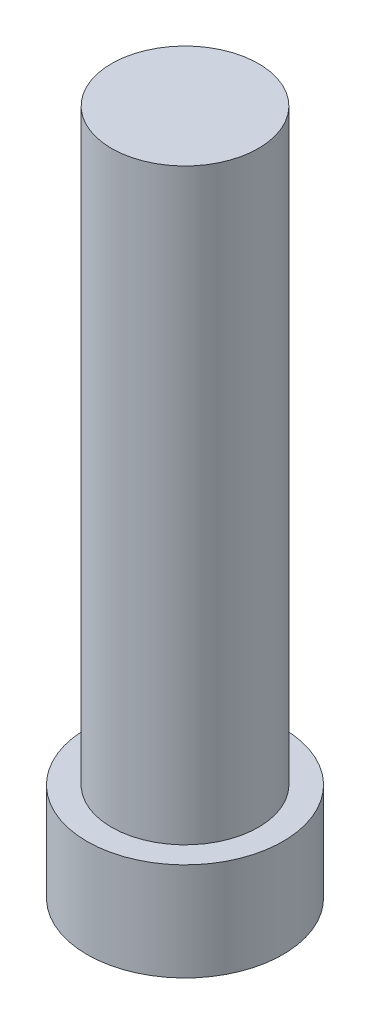
ISO-10303-21;
HEADER;
FILE_DESCRIPTION(('STEP AP214'),'2;1');
FILE_NAME('part.step','',(''),(''),'','','');
FILE_SCHEMA(('AUTOMOTIVE_DESIGN { 1 0 10303 214 1 1 1 1 }'));
ENDSEC;
DATA;
#1=APPLICATION_CONTEXT('core data for automotive mechanical design processes');
#2=APPLICATION_PROTOCOL_DEFINITION('international standard','automotive_design',2000,#1);
#3=PRODUCT_CONTEXT('',#1,'mechanical');
#4=PRODUCT('Part','Part','',(#3));
#5=PRODUCT_RELATED_PRODUCT_CATEGORY('part','',(#4));
#6=PRODUCT_DEFINITION_FORMATION('','',#4);
#7=PRODUCT_DEFINITION_CONTEXT('part definition',#1,'design');
#8=PRODUCT_DEFINITION('design','',#6,#7);
#9=PRODUCT_DEFINITION_SHAPE('','',#8);
#10=(LENGTH_UNIT() NAMED_UNIT(*) SI_UNIT(.MILLI.,.METRE.));
#11=(NAMED_UNIT(*) PLANE_ANGLE_UNIT() SI_UNIT($,.RADIAN.));
#12=(NAMED_UNIT(*) SI_UNIT($,.STERADIAN.) SOLID_ANGLE_UNIT());
#13=UNCERTAINTY_MEASURE_WITH_UNIT(LENGTH_MEASURE(1.E-05),#10,'distance_accuracy_value','');
#14=(GEOMETRIC_REPRESENTATION_CONTEXT(3) GLOBAL_UNCERTAINTY_ASSIGNED_CONTEXT((#13)) GLOBAL_UNIT_ASSIGNED_CONTEXT((#10,
#11,#12)) REPRESENTATION_CONTEXT('',''));
#15=CARTESIAN_POINT('',(0.,0.,0.));
#16=DIRECTION('',(0.,0.,1.));
#17=DIRECTION('',(1.,0.,0.));
#18=AXIS2_PLACEMENT_3D('',#15,#16,#17);
#19=CARTESIAN_POINT('',(0.,10.,0.));
#20=DIRECTION('',(0.,-1.,0.));
#21=DIRECTION('',(0.,0.,-1.));
#22=AXIS2_PLACEMENT_3D('',#19,#20,#21);
#23=CYLINDRICAL_SURFACE('',#22,10.);
#24=CARTESIAN_POINT('',(0.,10.,0.));
#25=DIRECTION('',(0.,1.,0.));
#26=DIRECTION('',(0.,0.,1.));
#27=AXIS2_PLACEMENT_3D('',#24,#25,#26);
#28=CIRCLE('',#27,10.);
#29=CARTESIAN_POINT('',(0.,10.,10.));
#30=VERTEX_POINT('',#29);
#31=EDGE_CURVE('E10',#30,#30,#28,.T.);
#32=ORIENTED_EDGE('',*,*,#31,.F.);
#33=EDGE_LOOP('',(#32));
#34=FACE_BOUND('',#33,.T.);
#35=CARTESIAN_POINT('',(0.,0.,0.));
#36=DIRECTION('',(0.,1.,0.));
#37=DIRECTION('',(0.,0.,1.));
#38=AXIS2_PLACEMENT_3D('',#35,#36,#37);
#39=CIRCLE('',#38,10.);
#40=CARTESIAN_POINT('',(0.,0.,10.));
#41=VERTEX_POINT('',#40);
#42=EDGE_CURVE('E34',#41,#41,#39,.T.);
#43=ORIENTED_EDGE('',*,*,#42,.T.);
#44=EDGE_LOOP('',(#43));
#45=FACE_BOUND('',#44,.T.);
#46=ADVANCED_FACE('F31',(#34,#45),#23,.T.);
#47=CARTESIAN_POINT('',(0.,10.,0.));
#48=DIRECTION('',(0.,1.,0.));
#49=DIRECTION('',(0.,0.,1.));
#50=AXIS2_PLACEMENT_3D('',#47,#48,#49);
#51=PLANE('',#50);
#52=CARTESIAN_POINT('',(0.,10.,0.));
#53=DIRECTION('',(0.,1.,0.));
#54=DIRECTION('',(0.,0.,1.));
#55=AXIS2_PLACEMENT_3D('',#52,#53,#54);
#56=CIRCLE('',#55,7.5);
#57=CARTESIAN_POINT('',(0.,10.,7.5));
#58=VERTEX_POINT('',#57);
#59=EDGE_CURVE('E43',#58,#58,#56,.T.);
#60=ORIENTED_EDGE('',*,*,#59,.F.);
#61=EDGE_LOOP('',(#60));
#62=FACE_BOUND('',#61,.T.);
#63=ORIENTED_EDGE('',*,*,#31,.T.);
#64=EDGE_LOOP('',(#63));
#65=FACE_BOUND('',#64,.T.);
#66=ADVANCED_FACE('F58',(#62,#65),#51,.T.);
#67=CARTESIAN_POINT('',(0.,0.,0.));
#68=DIRECTION('',(0.,1.,0.));
#69=DIRECTION('',(0.,0.,1.));
#70=AXIS2_PLACEMENT_3D('',#67,#68,#69);
#71=PLANE('',#70);
#72=ORIENTED_EDGE('',*,*,#42,.F.);
#73=EDGE_LOOP('',(#72));
#74=FACE_BOUND('',#73,.T.);
#75=ADVANCED_FACE('F54',(#74),#71,.F.);
#76=CARTESIAN_POINT('',(0.,70.,0.));
#77=DIRECTION('',(0.,-1.,0.));
#78=DIRECTION('',(0.,0.,-1.));
#79=AXIS2_PLACEMENT_3D('',#76,#77,#78);
#80=CYLINDRICAL_SURFACE('',#79,7.5);
#81=CARTESIAN_POINT('',(0.,70.,0.));
#82=DIRECTION('',(0.,1.,0.));
#83=DIRECTION('',(0.,0.,1.));
#84=AXIS2_PLACEMENT_3D('',#81,#82,#83);
#85=CIRCLE('',#84,7.5);
#86=CARTESIAN_POINT('',(0.,70.,7.5));
#87=VERTEX_POINT('',#86);
#88=EDGE_CURVE('E41',#87,#87,#85,.T.);
#89=ORIENTED_EDGE('',*,*,#88,.F.);
#90=EDGE_LOOP('',(#89));
#91=FACE_BOUND('',#90,.T.);
#92=ORIENTED_EDGE('',*,*,#59,.T.);
#93=EDGE_LOOP('',(#92));
#94=FACE_BOUND('',#93,.T.);
#95=ADVANCED_FACE('F51',(#91,#94),#80,.T.);
#96=CARTESIAN_POINT('',(0.,70.,0.));
#97=DIRECTION('',(0.,1.,0.));
#98=DIRECTION('',(0.,0.,1.));
#99=AXIS2_PLACEMENT_3D('',#96,#97,#98);
#100=PLANE('',#99);
#101=ORIENTED_EDGE('',*,*,#88,.T.);
#102=EDGE_LOOP('',(#101));
#103=FACE_BOUND('',#102,.T.);
#104=ADVANCED_FACE('F49',(#103),#100,.T.);
#105=CLOSED_SHELL('',(#46,#66,#75,#95,#104));
#106=MANIFOLD_SOLID_BREP('B2',#105);
#107=ADVANCED_BREP_SHAPE_REPRESENTATION('',(#18,#106),#14);
#108=SHAPE_DEFINITION_REPRESENTATION(#9,#107);
ENDSEC;
END-ISO-10303-21;
